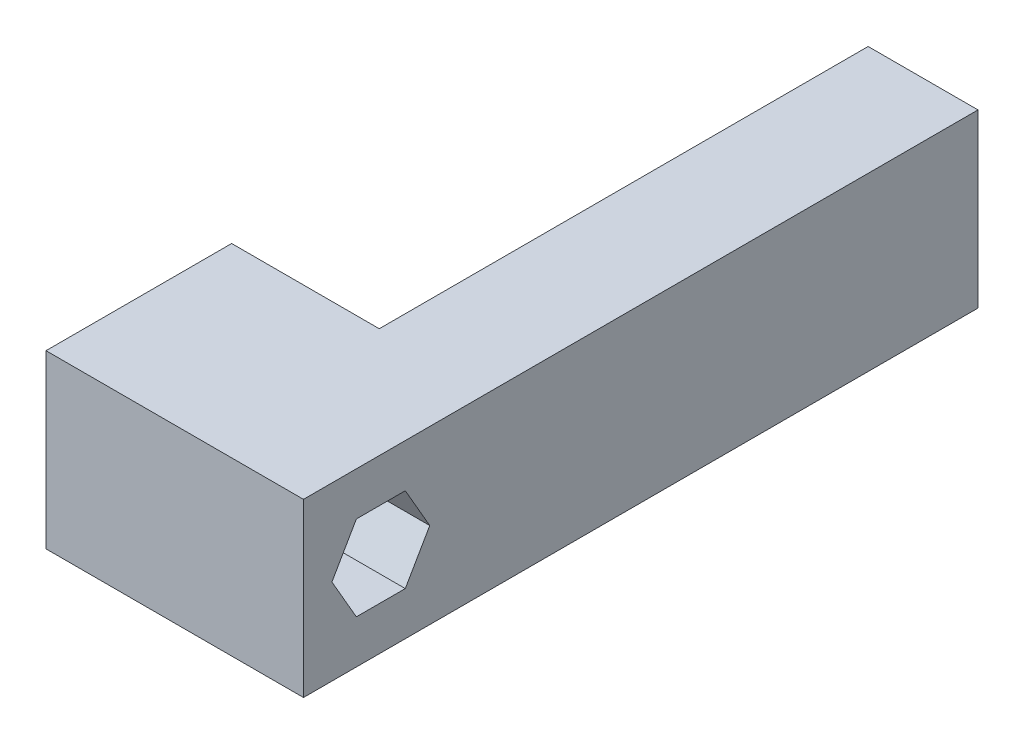
ISO-10303-21;
HEADER;
FILE_DESCRIPTION(('STEP AP214'),'2;1');
FILE_NAME('part.step','',(''),(''),'','','');
FILE_SCHEMA(('AUTOMOTIVE_DESIGN { 1 0 10303 214 1 1 1 1 }'));
ENDSEC;
DATA;
#1=APPLICATION_CONTEXT('core data for automotive mechanical design processes');
#2=APPLICATION_PROTOCOL_DEFINITION('international standard','automotive_design',2000,#1);
#3=PRODUCT_CONTEXT('',#1,'mechanical');
#4=PRODUCT('Part','Part','',(#3));
#5=PRODUCT_RELATED_PRODUCT_CATEGORY('part','',(#4));
#6=PRODUCT_DEFINITION_FORMATION('','',#4);
#7=PRODUCT_DEFINITION_CONTEXT('part definition',#1,'design');
#8=PRODUCT_DEFINITION('design','',#6,#7);
#9=PRODUCT_DEFINITION_SHAPE('','',#8);
#10=(LENGTH_UNIT() NAMED_UNIT(*) SI_UNIT(.MILLI.,.METRE.));
#11=(NAMED_UNIT(*) PLANE_ANGLE_UNIT() SI_UNIT($,.RADIAN.));
#12=(NAMED_UNIT(*) SI_UNIT($,.STERADIAN.) SOLID_ANGLE_UNIT());
#13=UNCERTAINTY_MEASURE_WITH_UNIT(LENGTH_MEASURE(1.E-05),#10,'distance_accuracy_value','');
#14=(GEOMETRIC_REPRESENTATION_CONTEXT(3) GLOBAL_UNCERTAINTY_ASSIGNED_CONTEXT((#13)) GLOBAL_UNIT_ASSIGNED_CONTEXT((#10,
#11,#12)) REPRESENTATION_CONTEXT('',''));
#15=CARTESIAN_POINT('',(0.,0.,0.));
#16=DIRECTION('',(0.,0.,1.));
#17=DIRECTION('',(1.,0.,0.));
#18=AXIS2_PLACEMENT_3D('',#15,#16,#17);
#19=CARTESIAN_POINT('',(0.,0.,-100.811469328144));
#20=DIRECTION('',(0.,0.,1.));
#21=DIRECTION('',(1.,0.,0.));
#22=AXIS2_PLACEMENT_3D('',#19,#20,#21);
#23=PLANE('',#22);
#24=DIRECTION('',(-1.,0.,0.));
#25=VECTOR('',#24,1.);
#26=CARTESIAN_POINT('',(0.,-25.4,-100.811469328144));
#27=LINE('',#26,#25);
#28=CARTESIAN_POINT('',(12.7,-25.4,-100.811469328144));
#29=VERTEX_POINT('',#28);
#30=CARTESIAN_POINT('',(-3.55599999999999,-25.4,-100.811469328144));
#31=VERTEX_POINT('',#30);
#32=EDGE_CURVE('E211',#29,#31,#27,.T.);
#33=ORIENTED_EDGE('',*,*,#32,.T.);
#34=DIRECTION('',(0.,-1.,0.));
#35=VECTOR('',#34,1.);
#36=CARTESIAN_POINT('',(-3.55599999999999,0.,-100.811469328144));
#37=LINE('',#36,#35);
#38=CARTESIAN_POINT('',(-3.55599999999999,0.,-100.811469328144));
#39=VERTEX_POINT('',#38);
#40=EDGE_CURVE('E248',#39,#31,#37,.T.);
#41=ORIENTED_EDGE('',*,*,#40,.F.);
#42=DIRECTION('',(1.,0.,0.));
#43=VECTOR('',#42,1.);
#44=CARTESIAN_POINT('',(0.,0.,-100.811469328144));
#45=LINE('',#44,#43);
#46=CARTESIAN_POINT('',(12.7,0.,-100.811469328144));
#47=VERTEX_POINT('',#46);
#48=EDGE_CURVE('E208',#39,#47,#45,.T.);
#49=ORIENTED_EDGE('',*,*,#48,.T.);
#50=DIRECTION('',(0.,-1.,0.));
#51=VECTOR('',#50,1.);
#52=CARTESIAN_POINT('',(12.7,0.,-100.811469328144));
#53=LINE('',#52,#51);
#54=EDGE_CURVE('E151',#47,#29,#53,.T.);
#55=ORIENTED_EDGE('',*,*,#54,.T.);
#56=EDGE_LOOP('',(#33,#41,#49,#55));
#57=FACE_BOUND('',#56,.T.);
#58=ADVANCED_FACE('F43',(#57),#23,.F.);
#59=CARTESIAN_POINT('',(12.7,0.,0.));
#60=DIRECTION('',(0.,1.,0.));
#61=DIRECTION('',(0.,0.,1.));
#62=AXIS2_PLACEMENT_3D('',#59,#60,#61);
#63=PLANE('',#62);
#64=DIRECTION('',(-1.,0.,0.));
#65=VECTOR('',#64,1.);
#66=CARTESIAN_POINT('',(12.7,0.,-1.));
#67=LINE('',#66,#65);
#68=CARTESIAN_POINT('',(12.7,0.,-1.));
#69=VERTEX_POINT('',#68);
#70=CARTESIAN_POINT('',(-25.4,0.,-1.00000000000001));
#71=VERTEX_POINT('',#70);
#72=EDGE_CURVE('E58',#69,#71,#67,.T.);
#73=ORIENTED_EDGE('',*,*,#72,.F.);
#74=DIRECTION('',(0.,0.,-1.));
#75=VECTOR('',#74,1.);
#76=CARTESIAN_POINT('',(12.7,0.,0.));
#77=LINE('',#76,#75);
#78=EDGE_CURVE('E141',#69,#47,#77,.T.);
#79=ORIENTED_EDGE('',*,*,#78,.T.);
#80=ORIENTED_EDGE('',*,*,#48,.F.);
#81=DIRECTION('',(0.,0.,-1.));
#82=VECTOR('',#81,1.);
#83=CARTESIAN_POINT('',(-3.55599999999999,0.,-100.811469328144));
#84=LINE('',#83,#82);
#85=CARTESIAN_POINT('',(-3.55599999999999,0.,-28.4713245616288));
#86=VERTEX_POINT('',#85);
#87=EDGE_CURVE('E241',#86,#39,#84,.T.);
#88=ORIENTED_EDGE('',*,*,#87,.F.);
#89=DIRECTION('',(1.,0.,0.));
#90=VECTOR('',#89,1.);
#91=CARTESIAN_POINT('',(-25.4,0.,-28.4713245616288));
#92=LINE('',#91,#90);
#93=CARTESIAN_POINT('',(-25.4,0.,-28.4713245616288));
#94=VERTEX_POINT('',#93);
#95=EDGE_CURVE('E204',#94,#86,#92,.T.);
#96=ORIENTED_EDGE('',*,*,#95,.F.);
#97=DIRECTION('',(0.,0.,-1.));
#98=VECTOR('',#97,1.);
#99=CARTESIAN_POINT('',(-25.4,0.,-28.4713245616288));
#100=LINE('',#99,#98);
#101=EDGE_CURVE('E144',#71,#94,#100,.T.);
#102=ORIENTED_EDGE('',*,*,#101,.F.);
#103=EDGE_LOOP('',(#73,#79,#80,#88,#96,#102));
#104=FACE_BOUND('',#103,.T.);
#105=ADVANCED_FACE('F140',(#104),#63,.T.);
#106=CARTESIAN_POINT('',(12.7,-25.4,0.));
#107=DIRECTION('',(0.,1.,0.));
#108=DIRECTION('',(0.,0.,1.));
#109=AXIS2_PLACEMENT_3D('',#106,#107,#108);
#110=PLANE('',#109);
#111=DIRECTION('',(0.,0.,-1.));
#112=VECTOR('',#111,1.);
#113=CARTESIAN_POINT('',(12.7,-25.4,0.));
#114=LINE('',#113,#112);
#115=CARTESIAN_POINT('',(12.7,-25.4,-1.));
#116=VERTEX_POINT('',#115);
#117=EDGE_CURVE('E152',#116,#29,#114,.T.);
#118=ORIENTED_EDGE('',*,*,#117,.F.);
#119=DIRECTION('',(1.,0.,0.));
#120=VECTOR('',#119,1.);
#121=CARTESIAN_POINT('',(12.7,-25.4,-1.));
#122=LINE('',#121,#120);
#123=CARTESIAN_POINT('',(-25.4,-25.4,-1.));
#124=VERTEX_POINT('',#123);
#125=EDGE_CURVE('E133',#124,#116,#122,.T.);
#126=ORIENTED_EDGE('',*,*,#125,.F.);
#127=DIRECTION('',(0.,0.,1.));
#128=VECTOR('',#127,1.);
#129=CARTESIAN_POINT('',(-25.4,-25.4,-28.4713245616288));
#130=LINE('',#129,#128);
#131=CARTESIAN_POINT('',(-25.4,-25.4,-28.4713245616288));
#132=VERTEX_POINT('',#131);
#133=EDGE_CURVE('E200',#132,#124,#130,.T.);
#134=ORIENTED_EDGE('',*,*,#133,.F.);
#135=DIRECTION('',(1.,0.,0.));
#136=VECTOR('',#135,1.);
#137=CARTESIAN_POINT('',(-25.4,-25.4,-28.4713245616288));
#138=LINE('',#137,#136);
#139=CARTESIAN_POINT('',(-3.55599999999999,-25.4,-28.4713245616288));
#140=VERTEX_POINT('',#139);
#141=EDGE_CURVE('E206',#132,#140,#138,.T.);
#142=ORIENTED_EDGE('',*,*,#141,.T.);
#143=DIRECTION('',(0.,0.,1.));
#144=VECTOR('',#143,1.);
#145=CARTESIAN_POINT('',(-3.55599999999999,-25.4,-100.811469328144));
#146=LINE('',#145,#144);
#147=EDGE_CURVE('E245',#31,#140,#146,.T.);
#148=ORIENTED_EDGE('',*,*,#147,.F.);
#149=ORIENTED_EDGE('',*,*,#32,.F.);
#150=EDGE_LOOP('',(#118,#126,#134,#142,#148,#149));
#151=FACE_BOUND('',#150,.T.);
#152=ADVANCED_FACE('F254',(#151),#110,.F.);
#153=CARTESIAN_POINT('',(12.7,-0.920302861247215,1.59401131403119));
#154=DIRECTION('',(0.,0.5,-0.866025403784439));
#155=DIRECTION('',(0.,0.866025403784439,0.5));
#156=AXIS2_PLACEMENT_3D('',#153,#154,#155);
#157=PLANE('',#156);
#158=DIRECTION('',(-1.,0.,0.));
#159=VECTOR('',#158,1.);
#160=CARTESIAN_POINT('',(12.7,-18.9691578979956,-8.8265));
#161=LINE('',#160,#159);
#162=CARTESIAN_POINT('',(12.7,-18.9691578979956,-8.8265));
#163=VERTEX_POINT('',#162);
#164=CARTESIAN_POINT('',(-25.4,-18.9691578979955,-8.82649999999994));
#165=VERTEX_POINT('',#164);
#166=EDGE_CURVE('E155',#163,#165,#161,.T.);
#167=ORIENTED_EDGE('',*,*,#166,.T.);
#168=DIRECTION('',(0.,0.866025403784444,0.499999999999991));
#169=VECTOR('',#168,1.);
#170=CARTESIAN_POINT('',(-25.4,-18.9691578979955,-8.82649999999994));
#171=LINE('',#170,#169);
#172=CARTESIAN_POINT('',(-25.4,-12.6999999999999,-5.207));
#173=VERTEX_POINT('',#172);
#174=EDGE_CURVE('E192',#165,#173,#171,.T.);
#175=ORIENTED_EDGE('',*,*,#174,.T.);
#176=DIRECTION('',(-1.,0.,0.));
#177=VECTOR('',#176,1.);
#178=CARTESIAN_POINT('',(12.7,-12.7,-5.207));
#179=LINE('',#178,#177);
#180=CARTESIAN_POINT('',(12.7,-12.7,-5.207));
#181=VERTEX_POINT('',#180);
#182=EDGE_CURVE('E11',#181,#173,#179,.T.);
#183=ORIENTED_EDGE('',*,*,#182,.F.);
#184=DIRECTION('',(0.,-0.866025403784439,-0.5));
#185=VECTOR('',#184,1.);
#186=CARTESIAN_POINT('',(12.7,-0.920302861247215,1.59401131403119));
#187=LINE('',#186,#185);
#188=EDGE_CURVE('E213',#181,#163,#187,.T.);
#189=ORIENTED_EDGE('',*,*,#188,.T.);
#190=EDGE_LOOP('',(#167,#175,#183,#189));
#191=FACE_BOUND('',#190,.T.);
#192=ADVANCED_FACE('F45',(#191),#157,.T.);
#193=CARTESIAN_POINT('',(12.7,-5.42969713875278,-9.40451131403119));
#194=DIRECTION('',(0.,-0.5,-0.866025403784439));
#195=DIRECTION('',(0.,0.866025403784439,-0.5));
#196=AXIS2_PLACEMENT_3D('',#193,#194,#195);
#197=PLANE('',#196);
#198=ORIENTED_EDGE('',*,*,#182,.T.);
#199=DIRECTION('',(0.,0.866025403784435,-0.500000000000005));
#200=VECTOR('',#199,1.);
#201=CARTESIAN_POINT('',(-25.4,-12.6999999999999,-5.207));
#202=LINE('',#201,#200);
#203=CARTESIAN_POINT('',(-25.4,-6.43084210200445,-8.8265));
#204=VERTEX_POINT('',#203);
#205=EDGE_CURVE('E185',#173,#204,#202,.T.);
#206=ORIENTED_EDGE('',*,*,#205,.T.);
#207=DIRECTION('',(-1.,0.,0.));
#208=VECTOR('',#207,1.);
#209=CARTESIAN_POINT('',(12.7,-6.43084210200445,-8.8265));
#210=LINE('',#209,#208);
#211=CARTESIAN_POINT('',(12.7,-6.43084210200445,-8.8265));
#212=VERTEX_POINT('',#211);
#213=EDGE_CURVE('E51',#212,#204,#210,.T.);
#214=ORIENTED_EDGE('',*,*,#213,.F.);
#215=DIRECTION('',(0.,-0.866025403784439,0.5));
#216=VECTOR('',#215,1.);
#217=CARTESIAN_POINT('',(12.7,-5.42969713875278,-9.40451131403119));
#218=LINE('',#217,#216);
#219=EDGE_CURVE('E216',#212,#181,#218,.T.);
#220=ORIENTED_EDGE('',*,*,#219,.T.);
#221=EDGE_LOOP('',(#198,#206,#214,#220));
#222=FACE_BOUND('',#221,.T.);
#223=ADVANCED_FACE('F191',(#222),#197,.T.);
#224=CARTESIAN_POINT('',(12.7,-6.43084210200445,0.));
#225=DIRECTION('',(0.,-1.,0.));
#226=DIRECTION('',(0.,0.,-1.));
#227=AXIS2_PLACEMENT_3D('',#224,#225,#226);
#228=PLANE('',#227);
#229=ORIENTED_EDGE('',*,*,#213,.T.);
#230=DIRECTION('',(0.,0.,-1.));
#231=VECTOR('',#230,1.);
#232=CARTESIAN_POINT('',(-25.4,-6.43084210200445,-8.8265));
#233=LINE('',#232,#231);
#234=CARTESIAN_POINT('',(-25.4,-6.43084210200446,-16.0655));
#235=VERTEX_POINT('',#234);
#236=EDGE_CURVE('E173',#204,#235,#233,.T.);
#237=ORIENTED_EDGE('',*,*,#236,.T.);
#238=DIRECTION('',(-1.,0.,0.));
#239=VECTOR('',#238,1.);
#240=CARTESIAN_POINT('',(12.7,-6.43084210200445,-16.0655));
#241=LINE('',#240,#239);
#242=CARTESIAN_POINT('',(12.7,-6.43084210200445,-16.0655));
#243=VERTEX_POINT('',#242);
#244=EDGE_CURVE('E167',#243,#235,#241,.T.);
#245=ORIENTED_EDGE('',*,*,#244,.F.);
#246=DIRECTION('',(0.,0.,1.));
#247=VECTOR('',#246,1.);
#248=CARTESIAN_POINT('',(12.7,-6.43084210200445,0.));
#249=LINE('',#248,#247);
#250=EDGE_CURVE('E175',#243,#212,#249,.T.);
#251=ORIENTED_EDGE('',*,*,#250,.T.);
#252=EDGE_LOOP('',(#229,#237,#245,#251));
#253=FACE_BOUND('',#252,.T.);
#254=ADVANCED_FACE('F172',(#253),#228,.T.);
#255=CARTESIAN_POINT('',(12.7,5.34885503674834,-9.2644886859688));
#256=DIRECTION('',(0.,-0.5,0.866025403784438));
#257=DIRECTION('',(0.,-0.866025403784438,-0.500000000000001));
#258=AXIS2_PLACEMENT_3D('',#255,#256,#257);
#259=PLANE('',#258);
#260=ORIENTED_EDGE('',*,*,#244,.T.);
#261=DIRECTION('',(0.,-0.866025403784441,-0.499999999999997));
#262=VECTOR('',#261,1.);
#263=CARTESIAN_POINT('',(-25.4,-6.43084210200446,-16.0655));
#264=LINE('',#263,#262);
#265=CARTESIAN_POINT('',(-25.4,-12.7,-19.685));
#266=VERTEX_POINT('',#265);
#267=EDGE_CURVE('E189',#235,#266,#264,.T.);
#268=ORIENTED_EDGE('',*,*,#267,.T.);
#269=DIRECTION('',(-1.,0.,0.));
#270=VECTOR('',#269,1.);
#271=CARTESIAN_POINT('',(12.7,-12.7,-19.685));
#272=LINE('',#271,#270);
#273=CARTESIAN_POINT('',(12.7,-12.7,-19.685));
#274=VERTEX_POINT('',#273);
#275=EDGE_CURVE('E165',#274,#266,#272,.T.);
#276=ORIENTED_EDGE('',*,*,#275,.F.);
#277=DIRECTION('',(0.,0.866025403784438,0.5));
#278=VECTOR('',#277,1.);
#279=CARTESIAN_POINT('',(12.7,5.34885503674834,-9.2644886859688));
#280=LINE('',#279,#278);
#281=EDGE_CURVE('E219',#274,#243,#280,.T.);
#282=ORIENTED_EDGE('',*,*,#281,.T.);
#283=EDGE_LOOP('',(#260,#268,#276,#282));
#284=FACE_BOUND('',#283,.T.);
#285=ADVANCED_FACE('F236',(#284),#259,.T.);
#286=CARTESIAN_POINT('',(12.7,-11.6988550367483,-20.2630113140312));
#287=DIRECTION('',(0.,0.5,0.866025403784439));
#288=DIRECTION('',(0.,-0.866025403784439,0.5));
#289=AXIS2_PLACEMENT_3D('',#286,#287,#288);
#290=PLANE('',#289);
#291=ORIENTED_EDGE('',*,*,#275,.T.);
#292=DIRECTION('',(0.,-0.866025403784435,0.500000000000006));
#293=VECTOR('',#292,1.);
#294=CARTESIAN_POINT('',(-25.4,-12.7,-19.685));
#295=LINE('',#294,#293);
#296=CARTESIAN_POINT('',(-25.4,-18.9691578979956,-16.0655));
#297=VERTEX_POINT('',#296);
#298=EDGE_CURVE('E237',#266,#297,#295,.T.);
#299=ORIENTED_EDGE('',*,*,#298,.T.);
#300=DIRECTION('',(-1.,0.,0.));
#301=VECTOR('',#300,1.);
#302=CARTESIAN_POINT('',(12.7,-18.9691578979956,-16.0655));
#303=LINE('',#302,#301);
#304=CARTESIAN_POINT('',(12.7,-18.9691578979956,-16.0655));
#305=VERTEX_POINT('',#304);
#306=EDGE_CURVE('E163',#305,#297,#303,.T.);
#307=ORIENTED_EDGE('',*,*,#306,.F.);
#308=DIRECTION('',(0.,0.866025403784439,-0.5));
#309=VECTOR('',#308,1.);
#310=CARTESIAN_POINT('',(12.7,-11.6988550367483,-20.2630113140312));
#311=LINE('',#310,#309);
#312=EDGE_CURVE('E158',#305,#274,#311,.T.);
#313=ORIENTED_EDGE('',*,*,#312,.T.);
#314=EDGE_LOOP('',(#291,#299,#307,#313));
#315=FACE_BOUND('',#314,.T.);
#316=ADVANCED_FACE('F224',(#315),#290,.T.);
#317=CARTESIAN_POINT('',(12.7,-18.9691578979956,0.));
#318=DIRECTION('',(0.,1.,0.));
#319=DIRECTION('',(0.,0.,1.));
#320=AXIS2_PLACEMENT_3D('',#317,#318,#319);
#321=PLANE('',#320);
#322=ORIENTED_EDGE('',*,*,#306,.T.);
#323=DIRECTION('',(0.,0.,1.));
#324=VECTOR('',#323,1.);
#325=CARTESIAN_POINT('',(-25.4,-18.9691578979956,-16.0655));
#326=LINE('',#325,#324);
#327=EDGE_CURVE('E233',#297,#165,#326,.T.);
#328=ORIENTED_EDGE('',*,*,#327,.T.);
#329=ORIENTED_EDGE('',*,*,#166,.F.);
#330=DIRECTION('',(0.,0.,-1.));
#331=VECTOR('',#330,1.);
#332=CARTESIAN_POINT('',(12.7,-18.9691578979956,0.));
#333=LINE('',#332,#331);
#334=EDGE_CURVE('E153',#163,#305,#333,.T.);
#335=ORIENTED_EDGE('',*,*,#334,.T.);
#336=EDGE_LOOP('',(#322,#328,#329,#335));
#337=FACE_BOUND('',#336,.T.);
#338=ADVANCED_FACE('F230',(#337),#321,.T.);
#339=CARTESIAN_POINT('',(12.7,0.,0.));
#340=DIRECTION('',(1.,0.,0.));
#341=DIRECTION('',(0.,0.,-1.));
#342=AXIS2_PLACEMENT_3D('',#339,#340,#341);
#343=PLANE('',#342);
#344=DIRECTION('',(0.,1.,0.));
#345=VECTOR('',#344,1.);
#346=CARTESIAN_POINT('',(12.7,0.,-1.));
#347=LINE('',#346,#345);
#348=EDGE_CURVE('E130',#116,#69,#347,.T.);
#349=ORIENTED_EDGE('',*,*,#348,.F.);
#350=ORIENTED_EDGE('',*,*,#117,.T.);
#351=ORIENTED_EDGE('',*,*,#54,.F.);
#352=ORIENTED_EDGE('',*,*,#78,.F.);
#353=EDGE_LOOP('',(#349,#350,#351,#352));
#354=FACE_BOUND('',#353,.T.);
#355=ORIENTED_EDGE('',*,*,#188,.F.);
#356=ORIENTED_EDGE('',*,*,#219,.F.);
#357=ORIENTED_EDGE('',*,*,#250,.F.);
#358=ORIENTED_EDGE('',*,*,#281,.F.);
#359=ORIENTED_EDGE('',*,*,#312,.F.);
#360=ORIENTED_EDGE('',*,*,#334,.F.);
#361=EDGE_LOOP('',(#355,#356,#357,#358,#359,#360));
#362=FACE_BOUND('',#361,.T.);
#363=ADVANCED_FACE('F148',(#354,#362),#343,.T.);
#364=CARTESIAN_POINT('',(-25.4,0.,-28.4713245616288));
#365=DIRECTION('',(0.,0.,1.));
#366=DIRECTION('',(1.,0.,0.));
#367=AXIS2_PLACEMENT_3D('',#364,#365,#366);
#368=PLANE('',#367);
#369=ORIENTED_EDGE('',*,*,#95,.T.);
#370=DIRECTION('',(0.,1.,0.));
#371=VECTOR('',#370,1.);
#372=CARTESIAN_POINT('',(-3.55599999999999,0.,-28.4713245616288));
#373=LINE('',#372,#371);
#374=EDGE_CURVE('E66',#140,#86,#373,.T.);
#375=ORIENTED_EDGE('',*,*,#374,.F.);
#376=ORIENTED_EDGE('',*,*,#141,.F.);
#377=DIRECTION('',(0.,-1.,0.));
#378=VECTOR('',#377,1.);
#379=CARTESIAN_POINT('',(-25.4,0.,-28.4713245616288));
#380=LINE('',#379,#378);
#381=EDGE_CURVE('E194',#94,#132,#380,.T.);
#382=ORIENTED_EDGE('',*,*,#381,.F.);
#383=EDGE_LOOP('',(#369,#375,#376,#382));
#384=FACE_BOUND('',#383,.T.);
#385=ADVANCED_FACE('F257',(#384),#368,.F.);
#386=CARTESIAN_POINT('',(-25.4,0.,0.));
#387=DIRECTION('',(-1.,0.,0.));
#388=DIRECTION('',(0.,0.,1.));
#389=AXIS2_PLACEMENT_3D('',#386,#387,#388);
#390=PLANE('',#389);
#391=DIRECTION('',(0.,-1.,0.));
#392=VECTOR('',#391,1.);
#393=CARTESIAN_POINT('',(-25.4,0.,-1.));
#394=LINE('',#393,#392);
#395=EDGE_CURVE('E145',#71,#124,#394,.T.);
#396=ORIENTED_EDGE('',*,*,#395,.F.);
#397=ORIENTED_EDGE('',*,*,#101,.T.);
#398=ORIENTED_EDGE('',*,*,#381,.T.);
#399=ORIENTED_EDGE('',*,*,#133,.T.);
#400=EDGE_LOOP('',(#396,#397,#398,#399));
#401=FACE_BOUND('',#400,.T.);
#402=ORIENTED_EDGE('',*,*,#205,.F.);
#403=ORIENTED_EDGE('',*,*,#174,.F.);
#404=ORIENTED_EDGE('',*,*,#327,.F.);
#405=ORIENTED_EDGE('',*,*,#298,.F.);
#406=ORIENTED_EDGE('',*,*,#267,.F.);
#407=ORIENTED_EDGE('',*,*,#236,.F.);
#408=EDGE_LOOP('',(#402,#403,#404,#405,#406,#407));
#409=FACE_BOUND('',#408,.T.);
#410=ADVANCED_FACE('F183',(#401,#409),#390,.T.);
#411=CARTESIAN_POINT('',(-3.55599999999999,0.,0.));
#412=DIRECTION('',(-1.,0.,0.));
#413=DIRECTION('',(0.,0.,1.));
#414=AXIS2_PLACEMENT_3D('',#411,#412,#413);
#415=PLANE('',#414);
#416=ORIENTED_EDGE('',*,*,#40,.T.);
#417=ORIENTED_EDGE('',*,*,#147,.T.);
#418=ORIENTED_EDGE('',*,*,#374,.T.);
#419=ORIENTED_EDGE('',*,*,#87,.T.);
#420=EDGE_LOOP('',(#416,#417,#418,#419));
#421=FACE_BOUND('',#420,.T.);
#422=ADVANCED_FACE('F260',(#421),#415,.T.);
#423=CARTESIAN_POINT('',(0.,0.,-1.));
#424=DIRECTION('',(0.,0.,-1.));
#425=DIRECTION('',(-1.,0.,0.));
#426=AXIS2_PLACEMENT_3D('',#423,#424,#425);
#427=PLANE('',#426);
#428=ORIENTED_EDGE('',*,*,#348,.T.);
#429=ORIENTED_EDGE('',*,*,#72,.T.);
#430=ORIENTED_EDGE('',*,*,#395,.T.);
#431=ORIENTED_EDGE('',*,*,#125,.T.);
#432=EDGE_LOOP('',(#428,#429,#430,#431));
#433=FACE_BOUND('',#432,.T.);
#434=ADVANCED_FACE('F131',(#433),#427,.F.);
#435=CLOSED_SHELL('',(#58,#105,#152,#192,#223,#254,#285,#316,#338,#363,#385,#410,#422,#434));
#436=MANIFOLD_SOLID_BREP('B2',#435);
#437=ADVANCED_BREP_SHAPE_REPRESENTATION('',(#18,#436),#14);
#438=SHAPE_DEFINITION_REPRESENTATION(#9,#437);
ENDSEC;
END-ISO-10303-21;
